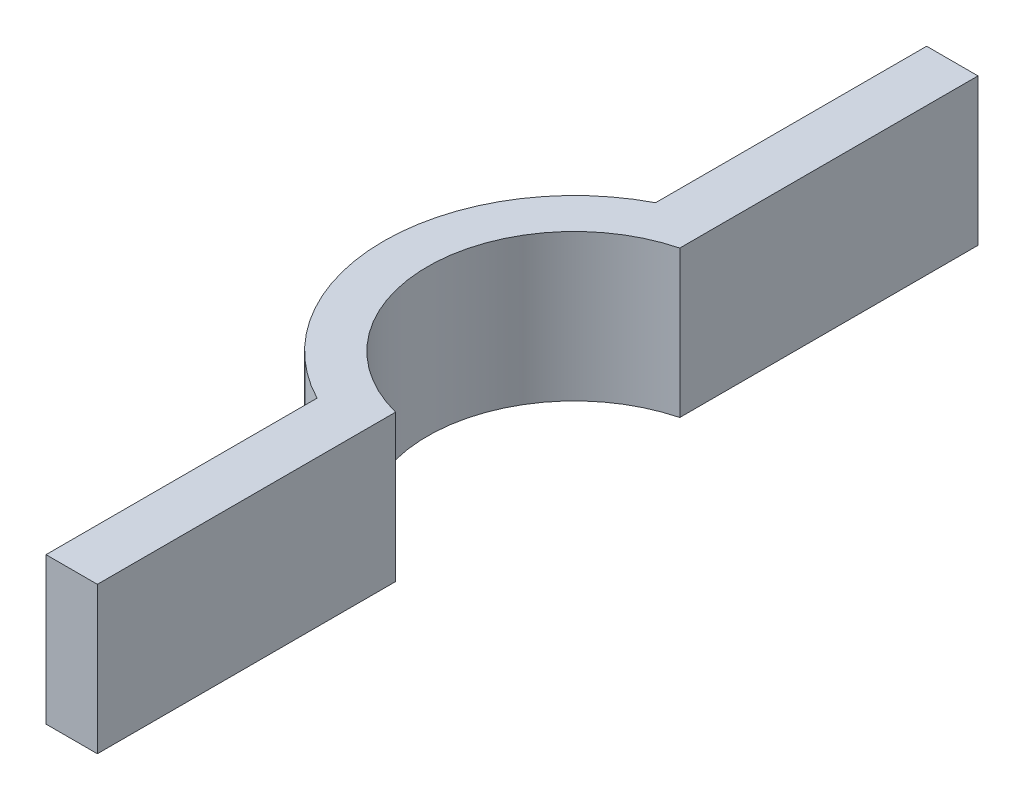
ISO-10303-21;
HEADER;
FILE_DESCRIPTION(('STEP AP214'),'2;1');
FILE_NAME('part.step','',(''),(''),'','','');
FILE_SCHEMA(('AUTOMOTIVE_DESIGN { 1 0 10303 214 1 1 1 1 }'));
ENDSEC;
DATA;
#1=APPLICATION_CONTEXT('core data for automotive mechanical design processes');
#2=APPLICATION_PROTOCOL_DEFINITION('international standard','automotive_design',2000,#1);
#3=PRODUCT_CONTEXT('',#1,'mechanical');
#4=PRODUCT('Part','Part','',(#3));
#5=PRODUCT_RELATED_PRODUCT_CATEGORY('part','',(#4));
#6=PRODUCT_DEFINITION_FORMATION('','',#4);
#7=PRODUCT_DEFINITION_CONTEXT('part definition',#1,'design');
#8=PRODUCT_DEFINITION('design','',#6,#7);
#9=PRODUCT_DEFINITION_SHAPE('','',#8);
#10=(LENGTH_UNIT() NAMED_UNIT(*) SI_UNIT(.MILLI.,.METRE.));
#11=(NAMED_UNIT(*) PLANE_ANGLE_UNIT() SI_UNIT($,.RADIAN.));
#12=(NAMED_UNIT(*) SI_UNIT($,.STERADIAN.) SOLID_ANGLE_UNIT());
#13=UNCERTAINTY_MEASURE_WITH_UNIT(LENGTH_MEASURE(1.E-05),#10,'distance_accuracy_value','');
#14=(GEOMETRIC_REPRESENTATION_CONTEXT(3) GLOBAL_UNCERTAINTY_ASSIGNED_CONTEXT((#13)) GLOBAL_UNIT_ASSIGNED_CONTEXT((#10,
#11,#12)) REPRESENTATION_CONTEXT('',''));
#15=CARTESIAN_POINT('',(0.,0.,0.));
#16=DIRECTION('',(0.,0.,1.));
#17=DIRECTION('',(1.,0.,0.));
#18=AXIS2_PLACEMENT_3D('',#15,#16,#17);
#19=CARTESIAN_POINT('',(0.,10.,0.));
#20=DIRECTION('',(0.,-1.,0.));
#21=DIRECTION('',(0.,0.,-1.));
#22=AXIS2_PLACEMENT_3D('',#19,#20,#21);
#23=CYLINDRICAL_SURFACE('',#22,13.);
#24=CARTESIAN_POINT('',(0.,10.,0.));
#25=DIRECTION('',(0.,1.,0.));
#26=DIRECTION('',(0.,0.,1.));
#27=AXIS2_PLACEMENT_3D('',#24,#25,#26);
#28=CIRCLE('',#27,13.);
#29=CARTESIAN_POINT('',(-6.,10.,-11.5325625946708));
#30=VERTEX_POINT('',#29);
#31=CARTESIAN_POINT('',(-5.99999999999999,10.,11.5325625946708));
#32=VERTEX_POINT('',#31);
#33=EDGE_CURVE('E143',#30,#32,#28,.T.);
#34=ORIENTED_EDGE('',*,*,#33,.F.);
#35=DIRECTION('',(0.,-1.,0.));
#36=VECTOR('',#35,1.);
#37=CARTESIAN_POINT('',(-6.,10.,-11.5325625946708));
#38=LINE('',#37,#36);
#39=CARTESIAN_POINT('',(-6.,0.,-11.5325625946708));
#40=VERTEX_POINT('',#39);
#41=EDGE_CURVE('E139',#30,#40,#38,.T.);
#42=ORIENTED_EDGE('',*,*,#41,.T.);
#43=CARTESIAN_POINT('',(0.,0.,0.));
#44=DIRECTION('',(0.,1.,0.));
#45=DIRECTION('',(0.,0.,1.));
#46=AXIS2_PLACEMENT_3D('',#43,#44,#45);
#47=CIRCLE('',#46,13.);
#48=CARTESIAN_POINT('',(-5.99999999999999,0.,11.5325625946708));
#49=VERTEX_POINT('',#48);
#50=EDGE_CURVE('E142',#40,#49,#47,.T.);
#51=ORIENTED_EDGE('',*,*,#50,.T.);
#52=DIRECTION('',(0.,-1.,0.));
#53=VECTOR('',#52,1.);
#54=CARTESIAN_POINT('',(-5.99999999999999,10.,11.5325625946708));
#55=LINE('',#54,#53);
#56=EDGE_CURVE('E135',#49,#32,#55,.F.);
#57=ORIENTED_EDGE('',*,*,#56,.T.);
#58=EDGE_LOOP('',(#34,#42,#51,#57));
#59=FACE_BOUND('',#58,.T.);
#60=ADVANCED_FACE('F34',(#59),#23,.T.);
#61=CARTESIAN_POINT('',(0.,10.,0.));
#62=DIRECTION('',(0.,1.,0.));
#63=DIRECTION('',(0.,0.,1.));
#64=AXIS2_PLACEMENT_3D('',#61,#62,#63);
#65=PLANE('',#64);
#66=DIRECTION('',(0.,0.,1.));
#67=VECTOR('',#66,1.);
#68=CARTESIAN_POINT('',(-2.5,10.,-30.));
#69=LINE('',#68,#67);
#70=CARTESIAN_POINT('',(-2.5,10.,-30.));
#71=VERTEX_POINT('',#70);
#72=CARTESIAN_POINT('',(-2.5,10.,-9.68245836551854));
#73=VERTEX_POINT('',#72);
#74=EDGE_CURVE('E48',#71,#73,#69,.T.);
#75=ORIENTED_EDGE('',*,*,#74,.F.);
#76=DIRECTION('',(-1.,0.,0.));
#77=VECTOR('',#76,1.);
#78=CARTESIAN_POINT('',(-6.,10.,-30.));
#79=LINE('',#78,#77);
#80=CARTESIAN_POINT('',(-6.,10.,-30.));
#81=VERTEX_POINT('',#80);
#82=EDGE_CURVE('E110',#71,#81,#79,.T.);
#83=ORIENTED_EDGE('',*,*,#82,.T.);
#84=DIRECTION('',(0.,0.,1.));
#85=VECTOR('',#84,1.);
#86=CARTESIAN_POINT('',(-6.,10.,-30.));
#87=LINE('',#86,#85);
#88=EDGE_CURVE('E127',#81,#30,#87,.T.);
#89=ORIENTED_EDGE('',*,*,#88,.T.);
#90=ORIENTED_EDGE('',*,*,#33,.T.);
#91=CARTESIAN_POINT('',(-5.99999999999999,10.,30.));
#92=VERTEX_POINT('',#91);
#93=EDGE_CURVE('E130',#32,#92,#87,.T.);
#94=ORIENTED_EDGE('',*,*,#93,.T.);
#95=DIRECTION('',(1.,0.,0.));
#96=VECTOR('',#95,1.);
#97=CARTESIAN_POINT('',(-5.99999999999999,10.,30.));
#98=LINE('',#97,#96);
#99=CARTESIAN_POINT('',(-2.49999999999999,10.,30.));
#100=VERTEX_POINT('',#99);
#101=EDGE_CURVE('E129',#92,#100,#98,.T.);
#102=ORIENTED_EDGE('',*,*,#101,.T.);
#103=CARTESIAN_POINT('',(-2.49999999999999,10.,9.68245836551854));
#104=VERTEX_POINT('',#103);
#105=EDGE_CURVE('E156',#104,#100,#69,.T.);
#106=ORIENTED_EDGE('',*,*,#105,.F.);
#107=CARTESIAN_POINT('',(0.,10.,0.));
#108=DIRECTION('',(0.,1.,0.));
#109=DIRECTION('',(0.,0.,1.));
#110=AXIS2_PLACEMENT_3D('',#107,#108,#109);
#111=CIRCLE('',#110,10.);
#112=EDGE_CURVE('E151',#73,#104,#111,.T.);
#113=ORIENTED_EDGE('',*,*,#112,.F.);
#114=EDGE_LOOP('',(#75,#83,#89,#90,#94,#102,#106,#113));
#115=FACE_BOUND('',#114,.T.);
#116=ADVANCED_FACE('F155',(#115),#65,.T.);
#117=CARTESIAN_POINT('',(0.,0.,0.));
#118=DIRECTION('',(0.,1.,0.));
#119=DIRECTION('',(0.,0.,1.));
#120=AXIS2_PLACEMENT_3D('',#117,#118,#119);
#121=PLANE('',#120);
#122=DIRECTION('',(-1.,0.,0.));
#123=VECTOR('',#122,1.);
#124=CARTESIAN_POINT('',(-6.,0.,-30.));
#125=LINE('',#124,#123);
#126=CARTESIAN_POINT('',(-2.5,0.,-30.));
#127=VERTEX_POINT('',#126);
#128=CARTESIAN_POINT('',(-6.,0.,-30.));
#129=VERTEX_POINT('',#128);
#130=EDGE_CURVE('E108',#127,#129,#125,.T.);
#131=ORIENTED_EDGE('',*,*,#130,.F.);
#132=DIRECTION('',(0.,0.,1.));
#133=VECTOR('',#132,1.);
#134=CARTESIAN_POINT('',(-2.5,0.,-30.));
#135=LINE('',#134,#133);
#136=CARTESIAN_POINT('',(-2.5,0.,-9.68245836551854));
#137=VERTEX_POINT('',#136);
#138=EDGE_CURVE('E95',#127,#137,#135,.T.);
#139=ORIENTED_EDGE('',*,*,#138,.T.);
#140=CARTESIAN_POINT('',(0.,0.,0.));
#141=DIRECTION('',(0.,1.,0.));
#142=DIRECTION('',(0.,0.,1.));
#143=AXIS2_PLACEMENT_3D('',#140,#141,#142);
#144=CIRCLE('',#143,10.);
#145=CARTESIAN_POINT('',(-2.49999999999999,0.,9.68245836551854));
#146=VERTEX_POINT('',#145);
#147=EDGE_CURVE('E152',#137,#146,#144,.T.);
#148=ORIENTED_EDGE('',*,*,#147,.T.);
#149=CARTESIAN_POINT('',(-2.49999999999999,0.,30.));
#150=VERTEX_POINT('',#149);
#151=EDGE_CURVE('E56',#146,#150,#135,.T.);
#152=ORIENTED_EDGE('',*,*,#151,.T.);
#153=DIRECTION('',(1.,0.,0.));
#154=VECTOR('',#153,1.);
#155=CARTESIAN_POINT('',(-5.99999999999999,0.,30.));
#156=LINE('',#155,#154);
#157=CARTESIAN_POINT('',(-5.99999999999999,0.,30.));
#158=VERTEX_POINT('',#157);
#159=EDGE_CURVE('E118',#158,#150,#156,.T.);
#160=ORIENTED_EDGE('',*,*,#159,.F.);
#161=DIRECTION('',(0.,0.,1.));
#162=VECTOR('',#161,1.);
#163=CARTESIAN_POINT('',(-6.,0.,-30.));
#164=LINE('',#163,#162);
#165=EDGE_CURVE('E134',#49,#158,#164,.T.);
#166=ORIENTED_EDGE('',*,*,#165,.F.);
#167=ORIENTED_EDGE('',*,*,#50,.F.);
#168=EDGE_CURVE('E116',#129,#40,#164,.T.);
#169=ORIENTED_EDGE('',*,*,#168,.F.);
#170=EDGE_LOOP('',(#131,#139,#148,#152,#160,#166,#167,#169));
#171=FACE_BOUND('',#170,.T.);
#172=ADVANCED_FACE('F114',(#171),#121,.F.);
#173=CARTESIAN_POINT('',(-5.99999999999999,0.,30.));
#174=DIRECTION('',(0.,0.,1.));
#175=DIRECTION('',(1.,0.,0.));
#176=AXIS2_PLACEMENT_3D('',#173,#174,#175);
#177=PLANE('',#176);
#178=DIRECTION('',(0.,-1.,0.));
#179=VECTOR('',#178,1.);
#180=CARTESIAN_POINT('',(-2.49999999999999,0.,30.));
#181=LINE('',#180,#179);
#182=EDGE_CURVE('E111',#100,#150,#181,.T.);
#183=ORIENTED_EDGE('',*,*,#182,.F.);
#184=ORIENTED_EDGE('',*,*,#101,.F.);
#185=DIRECTION('',(0.,1.,0.));
#186=VECTOR('',#185,1.);
#187=CARTESIAN_POINT('',(-5.99999999999999,0.,30.));
#188=LINE('',#187,#186);
#189=EDGE_CURVE('E117',#158,#92,#188,.T.);
#190=ORIENTED_EDGE('',*,*,#189,.F.);
#191=ORIENTED_EDGE('',*,*,#159,.T.);
#192=EDGE_LOOP('',(#183,#184,#190,#191));
#193=FACE_BOUND('',#192,.T.);
#194=ADVANCED_FACE('F170',(#193),#177,.T.);
#195=CARTESIAN_POINT('',(-6.,0.,-30.));
#196=DIRECTION('',(-1.,0.,0.));
#197=DIRECTION('',(0.,0.,1.));
#198=AXIS2_PLACEMENT_3D('',#195,#196,#197);
#199=PLANE('',#198);
#200=ORIENTED_EDGE('',*,*,#56,.F.);
#201=ORIENTED_EDGE('',*,*,#165,.T.);
#202=ORIENTED_EDGE('',*,*,#189,.T.);
#203=ORIENTED_EDGE('',*,*,#93,.F.);
#204=EDGE_LOOP('',(#200,#201,#202,#203));
#205=FACE_BOUND('',#204,.T.);
#206=ADVANCED_FACE('F165',(#205),#199,.T.);
#207=ORIENTED_EDGE('',*,*,#41,.F.);
#208=ORIENTED_EDGE('',*,*,#88,.F.);
#209=DIRECTION('',(0.,1.,0.));
#210=VECTOR('',#209,1.);
#211=CARTESIAN_POINT('',(-6.,0.,-30.));
#212=LINE('',#211,#210);
#213=EDGE_CURVE('E121',#129,#81,#212,.T.);
#214=ORIENTED_EDGE('',*,*,#213,.F.);
#215=ORIENTED_EDGE('',*,*,#168,.T.);
#216=EDGE_LOOP('',(#207,#208,#214,#215));
#217=FACE_BOUND('',#216,.T.);
#218=ADVANCED_FACE('F176',(#217),#199,.T.);
#219=CARTESIAN_POINT('',(-6.,0.,-30.));
#220=DIRECTION('',(0.,0.,-1.));
#221=DIRECTION('',(-1.,0.,0.));
#222=AXIS2_PLACEMENT_3D('',#219,#220,#221);
#223=PLANE('',#222);
#224=DIRECTION('',(0.,1.,0.));
#225=VECTOR('',#224,1.);
#226=CARTESIAN_POINT('',(-2.5,0.,-30.));
#227=LINE('',#226,#225);
#228=EDGE_CURVE('E98',#127,#71,#227,.T.);
#229=ORIENTED_EDGE('',*,*,#228,.F.);
#230=ORIENTED_EDGE('',*,*,#130,.T.);
#231=ORIENTED_EDGE('',*,*,#213,.T.);
#232=ORIENTED_EDGE('',*,*,#82,.F.);
#233=EDGE_LOOP('',(#229,#230,#231,#232));
#234=FACE_BOUND('',#233,.T.);
#235=ADVANCED_FACE('F106',(#234),#223,.T.);
#236=CARTESIAN_POINT('',(0.,0.,0.));
#237=DIRECTION('',(0.,1.,0.));
#238=DIRECTION('',(0.,0.,1.));
#239=AXIS2_PLACEMENT_3D('',#236,#237,#238);
#240=CYLINDRICAL_SURFACE('',#239,10.);
#241=ORIENTED_EDGE('',*,*,#112,.T.);
#242=DIRECTION('',(0.,1.,0.));
#243=VECTOR('',#242,1.);
#244=CARTESIAN_POINT('',(-2.49999999999999,0.,9.68245836551854));
#245=LINE('',#244,#243);
#246=EDGE_CURVE('E11',#104,#146,#245,.F.);
#247=ORIENTED_EDGE('',*,*,#246,.T.);
#248=ORIENTED_EDGE('',*,*,#147,.F.);
#249=DIRECTION('',(0.,1.,0.));
#250=VECTOR('',#249,1.);
#251=CARTESIAN_POINT('',(-2.5,0.,-9.68245836551854));
#252=LINE('',#251,#250);
#253=EDGE_CURVE('E41',#137,#73,#252,.T.);
#254=ORIENTED_EDGE('',*,*,#253,.T.);
#255=EDGE_LOOP('',(#241,#247,#248,#254));
#256=FACE_BOUND('',#255,.T.);
#257=ADVANCED_FACE('F150',(#256),#240,.F.);
#258=CARTESIAN_POINT('',(-2.5,0.,-30.));
#259=DIRECTION('',(-1.,0.,0.));
#260=DIRECTION('',(0.,0.,1.));
#261=AXIS2_PLACEMENT_3D('',#258,#259,#260);
#262=PLANE('',#261);
#263=ORIENTED_EDGE('',*,*,#138,.F.);
#264=ORIENTED_EDGE('',*,*,#228,.T.);
#265=ORIENTED_EDGE('',*,*,#74,.T.);
#266=ORIENTED_EDGE('',*,*,#253,.F.);
#267=EDGE_LOOP('',(#263,#264,#265,#266));
#268=FACE_BOUND('',#267,.T.);
#269=ADVANCED_FACE('F97',(#268),#262,.F.);
#270=ORIENTED_EDGE('',*,*,#182,.T.);
#271=ORIENTED_EDGE('',*,*,#151,.F.);
#272=ORIENTED_EDGE('',*,*,#246,.F.);
#273=ORIENTED_EDGE('',*,*,#105,.T.);
#274=EDGE_LOOP('',(#270,#271,#272,#273));
#275=FACE_BOUND('',#274,.T.);
#276=ADVANCED_FACE('F172',(#275),#262,.F.);
#277=CLOSED_SHELL('',(#60,#116,#172,#194,#206,#218,#235,#257,#269,#276));
#278=MANIFOLD_SOLID_BREP('B2',#277);
#279=ADVANCED_BREP_SHAPE_REPRESENTATION('',(#18,#278),#14);
#280=SHAPE_DEFINITION_REPRESENTATION(#9,#279);
ENDSEC;
END-ISO-10303-21;
